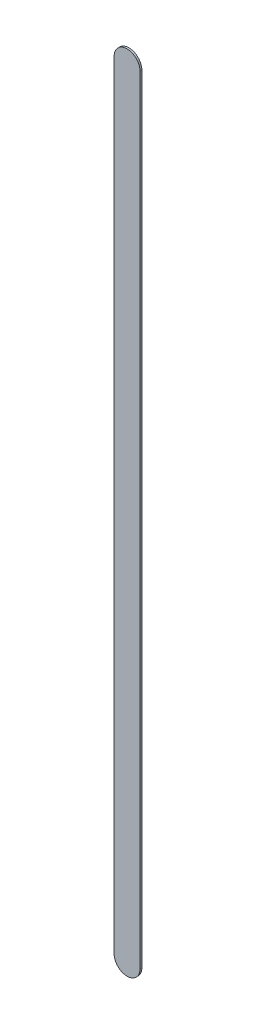
ISO-10303-21;
HEADER;
FILE_DESCRIPTION(('STEP AP214'),'2;1');
FILE_NAME('part.step','',(''),(''),'','','');
FILE_SCHEMA(('AUTOMOTIVE_DESIGN { 1 0 10303 214 1 1 1 1 }'));
ENDSEC;
DATA;
#1=APPLICATION_CONTEXT('core data for automotive mechanical design processes');
#2=APPLICATION_PROTOCOL_DEFINITION('international standard','automotive_design',2000,#1);
#3=PRODUCT_CONTEXT('',#1,'mechanical');
#4=PRODUCT('Part','Part','',(#3));
#5=PRODUCT_RELATED_PRODUCT_CATEGORY('part','',(#4));
#6=PRODUCT_DEFINITION_FORMATION('','',#4);
#7=PRODUCT_DEFINITION_CONTEXT('part definition',#1,'design');
#8=PRODUCT_DEFINITION('design','',#6,#7);
#9=PRODUCT_DEFINITION_SHAPE('','',#8);
#10=(LENGTH_UNIT() NAMED_UNIT(*) SI_UNIT(.MILLI.,.METRE.));
#11=(NAMED_UNIT(*) PLANE_ANGLE_UNIT() SI_UNIT($,.RADIAN.));
#12=(NAMED_UNIT(*) SI_UNIT($,.STERADIAN.) SOLID_ANGLE_UNIT());
#13=UNCERTAINTY_MEASURE_WITH_UNIT(LENGTH_MEASURE(1.E-05),#10,'distance_accuracy_value','');
#14=(GEOMETRIC_REPRESENTATION_CONTEXT(3) GLOBAL_UNCERTAINTY_ASSIGNED_CONTEXT((#13)) GLOBAL_UNIT_ASSIGNED_CONTEXT((#10,
#11,#12)) REPRESENTATION_CONTEXT('',''));
#15=CARTESIAN_POINT('',(0.,0.,0.));
#16=DIRECTION('',(0.,0.,1.));
#17=DIRECTION('',(1.,0.,0.));
#18=AXIS2_PLACEMENT_3D('',#15,#16,#17);
#19=CARTESIAN_POINT('',(96.64999974,81.49999956,0.));
#20=DIRECTION('',(-1.,0.,0.));
#21=DIRECTION('',(0.,1.,0.));
#22=AXIS2_PLACEMENT_3D('',#19,#20,#21);
#23=PLANE('',#22);
#24=DIRECTION('',(0.,1.,0.));
#25=VECTOR('',#24,1.);
#26=CARTESIAN_POINT('',(96.64999974,81.49999956,0.03556));
#27=LINE('',#26,#25);
#28=CARTESIAN_POINT('',(96.64999974,81.49999956,0.03556));
#29=VERTEX_POINT('',#28);
#30=CARTESIAN_POINT('',(96.64999974,96.50000004,0.03556));
#31=VERTEX_POINT('',#30);
#32=EDGE_CURVE('E11',#29,#31,#27,.T.);
#33=ORIENTED_EDGE('',*,*,#32,.F.);
#34=DIRECTION('',(0.,0.,1.));
#35=VECTOR('',#34,1.);
#36=CARTESIAN_POINT('',(96.64999974,81.49999956,0.));
#37=LINE('',#36,#35);
#38=CARTESIAN_POINT('',(96.64999974,81.49999956,0.));
#39=VERTEX_POINT('',#38);
#40=EDGE_CURVE('E24',#39,#29,#37,.T.);
#41=ORIENTED_EDGE('',*,*,#40,.F.);
#42=DIRECTION('',(0.,1.,0.));
#43=VECTOR('',#42,1.);
#44=CARTESIAN_POINT('',(96.64999974,81.49999956,0.));
#45=LINE('',#44,#43);
#46=CARTESIAN_POINT('',(96.64999974,96.50000004,0.));
#47=VERTEX_POINT('',#46);
#48=EDGE_CURVE('E75',#39,#47,#45,.T.);
#49=ORIENTED_EDGE('',*,*,#48,.T.);
#50=DIRECTION('',(0.,0.,1.));
#51=VECTOR('',#50,1.);
#52=CARTESIAN_POINT('',(96.64999974,96.50000004,0.));
#53=LINE('',#52,#51);
#54=EDGE_CURVE('E37',#47,#31,#53,.T.);
#55=ORIENTED_EDGE('',*,*,#54,.T.);
#56=EDGE_LOOP('',(#33,#41,#49,#55));
#57=FACE_BOUND('',#56,.T.);
#58=ADVANCED_FACE('F17',(#57),#23,.F.);
#59=CARTESIAN_POINT('',(96.40000024,96.50000004,0.));
#60=DIRECTION('',(0.,0.,-1.));
#61=DIRECTION('',(1.,0.,0.));
#62=AXIS2_PLACEMENT_3D('',#59,#60,#61);
#63=CYLINDRICAL_SURFACE('',#62,0.249999500000001);
#64=CARTESIAN_POINT('',(96.40000024,96.50000004,0.03556));
#65=DIRECTION('',(0.,0.,1.));
#66=DIRECTION('',(1.,0.,0.));
#67=AXIS2_PLACEMENT_3D('',#64,#65,#66);
#68=CIRCLE('',#67,0.249999500000001);
#69=CARTESIAN_POINT('',(96.15000074,96.50000004,0.03556));
#70=VERTEX_POINT('',#69);
#71=EDGE_CURVE('E83',#31,#70,#68,.T.);
#72=ORIENTED_EDGE('',*,*,#71,.F.);
#73=ORIENTED_EDGE('',*,*,#54,.F.);
#74=CARTESIAN_POINT('',(96.40000024,96.50000004,0.));
#75=DIRECTION('',(0.,0.,1.));
#76=DIRECTION('',(1.,0.,0.));
#77=AXIS2_PLACEMENT_3D('',#74,#75,#76);
#78=CIRCLE('',#77,0.249999500000001);
#79=CARTESIAN_POINT('',(96.15000074,96.50000004,0.));
#80=VERTEX_POINT('',#79);
#81=EDGE_CURVE('E81',#47,#80,#78,.T.);
#82=ORIENTED_EDGE('',*,*,#81,.T.);
#83=DIRECTION('',(0.,0.,1.));
#84=VECTOR('',#83,1.);
#85=CARTESIAN_POINT('',(96.15000074,96.50000004,0.));
#86=LINE('',#85,#84);
#87=EDGE_CURVE('E67',#80,#70,#86,.T.);
#88=ORIENTED_EDGE('',*,*,#87,.T.);
#89=EDGE_LOOP('',(#72,#73,#82,#88));
#90=FACE_BOUND('',#89,.T.);
#91=ADVANCED_FACE('F89',(#90),#63,.T.);
#92=CARTESIAN_POINT('',(96.15000074,96.50000004,0.));
#93=DIRECTION('',(1.,0.,0.));
#94=DIRECTION('',(0.,-1.,0.));
#95=AXIS2_PLACEMENT_3D('',#92,#93,#94);
#96=PLANE('',#95);
#97=DIRECTION('',(0.,-1.,0.));
#98=VECTOR('',#97,1.);
#99=CARTESIAN_POINT('',(96.15000074,96.50000004,0.03556));
#100=LINE('',#99,#98);
#101=CARTESIAN_POINT('',(96.15000074,81.49999956,0.03556));
#102=VERTEX_POINT('',#101);
#103=EDGE_CURVE('E71',#70,#102,#100,.T.);
#104=ORIENTED_EDGE('',*,*,#103,.F.);
#105=ORIENTED_EDGE('',*,*,#87,.F.);
#106=DIRECTION('',(0.,-1.,0.));
#107=VECTOR('',#106,1.);
#108=CARTESIAN_POINT('',(96.15000074,96.50000004,0.));
#109=LINE('',#108,#107);
#110=CARTESIAN_POINT('',(96.15000074,81.49999956,0.));
#111=VERTEX_POINT('',#110);
#112=EDGE_CURVE('E63',#80,#111,#109,.T.);
#113=ORIENTED_EDGE('',*,*,#112,.T.);
#114=DIRECTION('',(0.,0.,1.));
#115=VECTOR('',#114,1.);
#116=CARTESIAN_POINT('',(96.15000074,81.49999956,0.));
#117=LINE('',#116,#115);
#118=EDGE_CURVE('E53',#111,#102,#117,.T.);
#119=ORIENTED_EDGE('',*,*,#118,.T.);
#120=EDGE_LOOP('',(#104,#105,#113,#119));
#121=FACE_BOUND('',#120,.T.);
#122=ADVANCED_FACE('F66',(#121),#96,.F.);
#123=CARTESIAN_POINT('',(96.40000024,81.49999956,0.));
#124=DIRECTION('',(0.,0.,-1.));
#125=DIRECTION('',(-1.,0.,0.));
#126=AXIS2_PLACEMENT_3D('',#123,#124,#125);
#127=CYLINDRICAL_SURFACE('',#126,0.249999500000001);
#128=CARTESIAN_POINT('',(96.40000024,81.49999956,0.03556));
#129=DIRECTION('',(0.,0.,1.));
#130=DIRECTION('',(-1.,0.,0.));
#131=AXIS2_PLACEMENT_3D('',#128,#129,#130);
#132=CIRCLE('',#131,0.249999500000001);
#133=EDGE_CURVE('E59',#102,#29,#132,.T.);
#134=ORIENTED_EDGE('',*,*,#133,.F.);
#135=ORIENTED_EDGE('',*,*,#118,.F.);
#136=CARTESIAN_POINT('',(96.40000024,81.49999956,0.));
#137=DIRECTION('',(0.,0.,1.));
#138=DIRECTION('',(-1.,0.,0.));
#139=AXIS2_PLACEMENT_3D('',#136,#137,#138);
#140=CIRCLE('',#139,0.249999500000001);
#141=EDGE_CURVE('E57',#111,#39,#140,.T.);
#142=ORIENTED_EDGE('',*,*,#141,.T.);
#143=ORIENTED_EDGE('',*,*,#40,.T.);
#144=EDGE_LOOP('',(#134,#135,#142,#143));
#145=FACE_BOUND('',#144,.T.);
#146=ADVANCED_FACE('F55',(#145),#127,.T.);
#147=CARTESIAN_POINT('',(96.64999974,81.49999956,0.));
#148=DIRECTION('',(0.,0.,-1.));
#149=DIRECTION('',(-1.,0.,0.));
#150=AXIS2_PLACEMENT_3D('',#147,#148,#149);
#151=PLANE('',#150);
#152=ORIENTED_EDGE('',*,*,#141,.F.);
#153=ORIENTED_EDGE('',*,*,#112,.F.);
#154=ORIENTED_EDGE('',*,*,#81,.F.);
#155=ORIENTED_EDGE('',*,*,#48,.F.);
#156=EDGE_LOOP('',(#152,#153,#154,#155));
#157=FACE_BOUND('',#156,.T.);
#158=ADVANCED_FACE('F74',(#157),#151,.T.);
#159=CARTESIAN_POINT('',(96.64999974,81.49999956,0.03556));
#160=DIRECTION('',(0.,0.,-1.));
#161=DIRECTION('',(-1.,0.,0.));
#162=AXIS2_PLACEMENT_3D('',#159,#160,#161);
#163=PLANE('',#162);
#164=ORIENTED_EDGE('',*,*,#32,.T.);
#165=ORIENTED_EDGE('',*,*,#71,.T.);
#166=ORIENTED_EDGE('',*,*,#103,.T.);
#167=ORIENTED_EDGE('',*,*,#133,.T.);
#168=EDGE_LOOP('',(#164,#165,#166,#167));
#169=FACE_BOUND('',#168,.T.);
#170=ADVANCED_FACE('F91',(#169),#163,.F.);
#171=CLOSED_SHELL('',(#58,#91,#122,#146,#158,#170));
#172=MANIFOLD_SOLID_BREP('B1',#171);
#173=ADVANCED_BREP_SHAPE_REPRESENTATION('',(#18,#172),#14);
#174=SHAPE_DEFINITION_REPRESENTATION(#9,#173);
ENDSEC;
END-ISO-10303-21;
